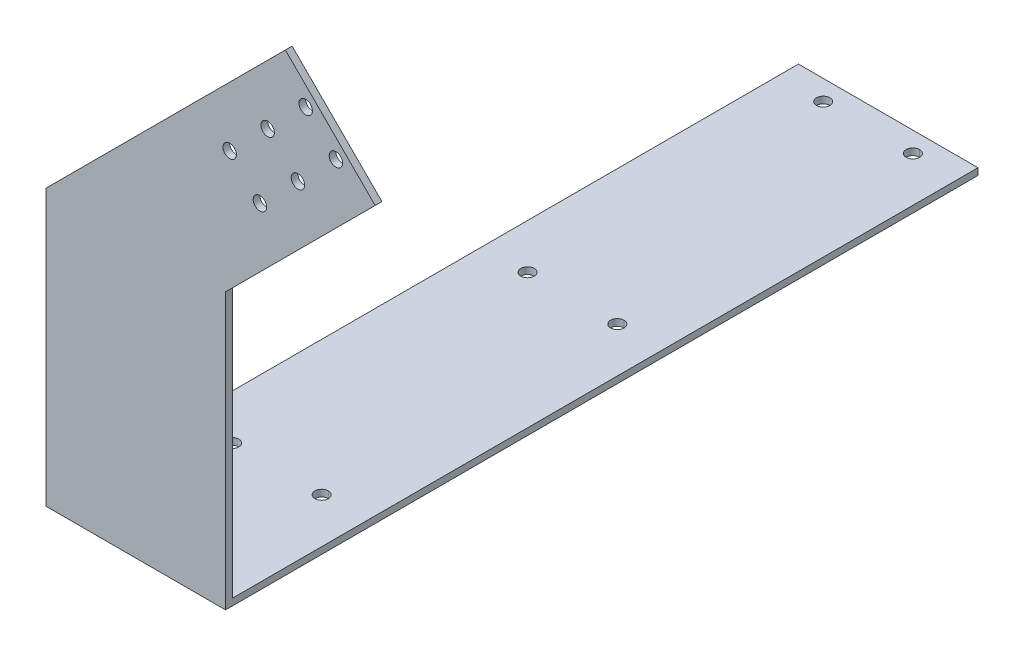
ISO-10303-21;
HEADER;
FILE_DESCRIPTION(('STEP AP214'),'2;1');
FILE_NAME('part.step','',(''),(''),'','','');
FILE_SCHEMA(('AUTOMOTIVE_DESIGN { 1 0 10303 214 1 1 1 1 }'));
ENDSEC;
DATA;
#1=APPLICATION_CONTEXT('core data for automotive mechanical design processes');
#2=APPLICATION_PROTOCOL_DEFINITION('international standard','automotive_design',2000,#1);
#3=PRODUCT_CONTEXT('',#1,'mechanical');
#4=PRODUCT('Part','Part','',(#3));
#5=PRODUCT_RELATED_PRODUCT_CATEGORY('part','',(#4));
#6=PRODUCT_DEFINITION_FORMATION('','',#4);
#7=PRODUCT_DEFINITION_CONTEXT('part definition',#1,'design');
#8=PRODUCT_DEFINITION('design','',#6,#7);
#9=PRODUCT_DEFINITION_SHAPE('','',#8);
#10=(LENGTH_UNIT() NAMED_UNIT(*) SI_UNIT(.MILLI.,.METRE.));
#11=(NAMED_UNIT(*) PLANE_ANGLE_UNIT() SI_UNIT($,.RADIAN.));
#12=(NAMED_UNIT(*) SI_UNIT($,.STERADIAN.) SOLID_ANGLE_UNIT());
#13=UNCERTAINTY_MEASURE_WITH_UNIT(LENGTH_MEASURE(1.E-05),#10,'distance_accuracy_value','');
#14=(GEOMETRIC_REPRESENTATION_CONTEXT(3) GLOBAL_UNCERTAINTY_ASSIGNED_CONTEXT((#13)) GLOBAL_UNIT_ASSIGNED_CONTEXT((#10,
#11,#12)) REPRESENTATION_CONTEXT('',''));
#15=CARTESIAN_POINT('',(0.,0.,0.));
#16=DIRECTION('',(0.,0.,1.));
#17=DIRECTION('',(1.,0.,0.));
#18=AXIS2_PLACEMENT_3D('',#15,#16,#17);
#19=CARTESIAN_POINT('',(244.242072319472,-1253.5476832005,-5408.71927487449));
#20=DIRECTION('',(-1.,0.,0.));
#21=DIRECTION('',(0.,0.,1.));
#22=AXIS2_PLACEMENT_3D('',#19,#20,#21);
#23=PLANE('',#22);
#24=DIRECTION('',(0.,-1.,0.));
#25=VECTOR('',#24,1.);
#26=CARTESIAN_POINT('',(244.242072319472,-1253.5476832005,-5402.36927487449));
#27=LINE('',#26,#25);
#28=CARTESIAN_POINT('',(244.242072319472,-999.547683200505,-5402.36927487449));
#29=VERTEX_POINT('',#28);
#30=CARTESIAN_POINT('',(244.242072319472,-1259.89768320051,-5402.36927487449));
#31=VERTEX_POINT('',#30);
#32=EDGE_CURVE('E123',#29,#31,#27,.T.);
#33=ORIENTED_EDGE('',*,*,#32,.F.);
#34=DIRECTION('',(0.,0.,1.));
#35=VECTOR('',#34,1.);
#36=CARTESIAN_POINT('',(244.242072319472,-999.547683200505,-5408.71927487449));
#37=LINE('',#36,#35);
#38=CARTESIAN_POINT('',(244.242072319472,-999.547683200505,-5408.71927487449));
#39=VERTEX_POINT('',#38);
#40=EDGE_CURVE('E11',#39,#29,#37,.T.);
#41=ORIENTED_EDGE('',*,*,#40,.F.);
#42=DIRECTION('',(0.,-1.,0.));
#43=VECTOR('',#42,1.);
#44=CARTESIAN_POINT('',(244.242072319472,-1253.5476832005,-5408.71927487449));
#45=LINE('',#44,#43);
#46=CARTESIAN_POINT('',(244.242072319472,-1253.5476832005,-5408.71927487449));
#47=VERTEX_POINT('',#46);
#48=EDGE_CURVE('E140',#39,#47,#45,.T.);
#49=ORIENTED_EDGE('',*,*,#48,.T.);
#50=DIRECTION('',(0.,0.,-1.));
#51=VECTOR('',#50,1.);
#52=CARTESIAN_POINT('',(244.242072319472,-1253.5476832005,-5402.36927487449));
#53=LINE('',#52,#51);
#54=CARTESIAN_POINT('',(244.242072319472,-1253.5476832005,-6113.56927487449));
#55=VERTEX_POINT('',#54);
#56=EDGE_CURVE('E217',#47,#55,#53,.T.);
#57=ORIENTED_EDGE('',*,*,#56,.T.);
#58=DIRECTION('',(0.,1.,0.));
#59=VECTOR('',#58,1.);
#60=CARTESIAN_POINT('',(244.242072319472,-1259.89768320051,-6113.56927487449));
#61=LINE('',#60,#59);
#62=CARTESIAN_POINT('',(244.242072319472,-1259.89768320051,-6113.56927487449));
#63=VERTEX_POINT('',#62);
#64=EDGE_CURVE('E283',#63,#55,#61,.T.);
#65=ORIENTED_EDGE('',*,*,#64,.F.);
#66=DIRECTION('',(0.,0.,-1.));
#67=VECTOR('',#66,1.);
#68=CARTESIAN_POINT('',(244.242072319472,-1259.89768320051,-5402.36927487449));
#69=LINE('',#68,#67);
#70=EDGE_CURVE('E164',#31,#63,#69,.T.);
#71=ORIENTED_EDGE('',*,*,#70,.F.);
#72=EDGE_LOOP('',(#33,#41,#49,#57,#65,#71));
#73=FACE_BOUND('',#72,.T.);
#74=ADVANCED_FACE('F43',(#73),#23,.T.);
#75=CARTESIAN_POINT('',(244.242072319472,-999.547683200505,-5408.71927487449));
#76=DIRECTION('',(-0.707106781186549,0.707106781186546,0.));
#77=DIRECTION('',(-0.707106781186546,-0.707106781186549,0.));
#78=AXIS2_PLACEMENT_3D('',#75,#76,#77);
#79=PLANE('',#78);
#80=DIRECTION('',(-0.707106781186546,-0.707106781186549,0.));
#81=VECTOR('',#80,1.);
#82=CARTESIAN_POINT('',(244.242072319472,-999.547683200505,-5402.36927487449));
#83=LINE('',#82,#81);
#84=CARTESIAN_POINT('',(470.516242299167,-773.273513220809,-5402.36927487449));
#85=VERTEX_POINT('',#84);
#86=EDGE_CURVE('E137',#85,#29,#83,.T.);
#87=ORIENTED_EDGE('',*,*,#86,.F.);
#88=DIRECTION('',(0.,0.,1.));
#89=VECTOR('',#88,1.);
#90=CARTESIAN_POINT('',(470.516242299167,-773.273513220809,-5408.71927487449));
#91=LINE('',#90,#89);
#92=CARTESIAN_POINT('',(470.516242299167,-773.273513220809,-5408.71927487449));
#93=VERTEX_POINT('',#92);
#94=EDGE_CURVE('E53',#93,#85,#91,.T.);
#95=ORIENTED_EDGE('',*,*,#94,.F.);
#96=DIRECTION('',(-0.707106781186546,-0.707106781186549,0.));
#97=VECTOR('',#96,1.);
#98=CARTESIAN_POINT('',(244.242072319472,-999.547683200505,-5408.71927487449));
#99=LINE('',#98,#97);
#100=EDGE_CURVE('E110',#93,#39,#99,.T.);
#101=ORIENTED_EDGE('',*,*,#100,.T.);
#102=ORIENTED_EDGE('',*,*,#40,.T.);
#103=EDGE_LOOP('',(#87,#95,#101,#102));
#104=FACE_BOUND('',#103,.T.);
#105=ADVANCED_FACE('F424',(#104),#79,.T.);
#106=CARTESIAN_POINT('',(470.516242299167,-773.273513220809,-5408.71927487449));
#107=DIRECTION('',(0.707088562607808,0.707124999295899,0.));
#108=DIRECTION('',(-0.707124999295899,0.707088562607808,0.));
#109=AXIS2_PLACEMENT_3D('',#106,#107,#108);
#110=PLANE('',#109);
#111=DIRECTION('',(-0.707124999295898,0.707088562607808,0.));
#112=VECTOR('',#111,1.);
#113=CARTESIAN_POINT('',(470.516242299167,-773.273513220809,-5402.36927487449));
#114=LINE('',#113,#112);
#115=CARTESIAN_POINT('',(555.373428556782,-858.126326963196,-5402.36927487449));
#116=VERTEX_POINT('',#115);
#117=EDGE_CURVE('E100',#116,#85,#114,.T.);
#118=ORIENTED_EDGE('',*,*,#117,.F.);
#119=DIRECTION('',(0.,0.,1.));
#120=VECTOR('',#119,1.);
#121=CARTESIAN_POINT('',(555.373428556782,-858.126326963196,-5408.71927487449));
#122=LINE('',#121,#120);
#123=CARTESIAN_POINT('',(555.373428556782,-858.126326963196,-5408.71927487449));
#124=VERTEX_POINT('',#123);
#125=EDGE_CURVE('E95',#124,#116,#122,.T.);
#126=ORIENTED_EDGE('',*,*,#125,.F.);
#127=DIRECTION('',(-0.707124999295898,0.707088562607808,0.));
#128=VECTOR('',#127,1.);
#129=CARTESIAN_POINT('',(470.516242299167,-773.273513220809,-5408.71927487449));
#130=LINE('',#129,#128);
#131=EDGE_CURVE('E98',#124,#93,#130,.T.);
#132=ORIENTED_EDGE('',*,*,#131,.T.);
#133=ORIENTED_EDGE('',*,*,#94,.T.);
#134=EDGE_LOOP('',(#118,#126,#132,#133));
#135=FACE_BOUND('',#134,.T.);
#136=ADVANCED_FACE('F97',(#135),#110,.T.);
#137=CARTESIAN_POINT('',(413.952072319473,-999.547683200505,-5408.71927487449));
#138=DIRECTION('',(0.707106781186547,-0.707106781186548,0.));
#139=DIRECTION('',(0.707106781186548,0.707106781186547,0.));
#140=AXIS2_PLACEMENT_3D('',#137,#138,#139);
#141=PLANE('',#140);
#142=DIRECTION('',(0.707106781186548,0.707106781186547,0.));
#143=VECTOR('',#142,1.);
#144=CARTESIAN_POINT('',(413.952072319473,-999.547683200505,-5402.36927487449));
#145=LINE('',#144,#143);
#146=CARTESIAN_POINT('',(413.952072319473,-999.547683200505,-5402.36927487449));
#147=VERTEX_POINT('',#146);
#148=EDGE_CURVE('E132',#147,#116,#145,.T.);
#149=ORIENTED_EDGE('',*,*,#148,.F.);
#150=DIRECTION('',(0.,0.,1.));
#151=VECTOR('',#150,1.);
#152=CARTESIAN_POINT('',(413.952072319473,-999.547683200505,-5408.71927487449));
#153=LINE('',#152,#151);
#154=CARTESIAN_POINT('',(413.952072319473,-999.547683200505,-5408.71927487449));
#155=VERTEX_POINT('',#154);
#156=EDGE_CURVE('E46',#155,#147,#153,.T.);
#157=ORIENTED_EDGE('',*,*,#156,.F.);
#158=DIRECTION('',(0.707106781186548,0.707106781186547,0.));
#159=VECTOR('',#158,1.);
#160=CARTESIAN_POINT('',(413.952072319473,-999.547683200505,-5408.71927487449));
#161=LINE('',#160,#159);
#162=EDGE_CURVE('E108',#155,#124,#161,.T.);
#163=ORIENTED_EDGE('',*,*,#162,.T.);
#164=ORIENTED_EDGE('',*,*,#125,.T.);
#165=EDGE_LOOP('',(#149,#157,#163,#164));
#166=FACE_BOUND('',#165,.T.);
#167=ADVANCED_FACE('F113',(#166),#141,.T.);
#168=CARTESIAN_POINT('',(413.952072319473,-1253.5476832005,-5408.71927487449));
#169=DIRECTION('',(1.,0.,0.));
#170=DIRECTION('',(0.,1.,0.));
#171=AXIS2_PLACEMENT_3D('',#168,#169,#170);
#172=PLANE('',#171);
#173=DIRECTION('',(0.,1.,0.));
#174=VECTOR('',#173,1.);
#175=CARTESIAN_POINT('',(413.952072319473,-1253.5476832005,-5402.36927487449));
#176=LINE('',#175,#174);
#177=CARTESIAN_POINT('',(413.952072319473,-1259.8976832005,-5402.36927487449));
#178=VERTEX_POINT('',#177);
#179=EDGE_CURVE('E127',#178,#147,#176,.T.);
#180=ORIENTED_EDGE('',*,*,#179,.F.);
#181=DIRECTION('',(0.,0.,-1.));
#182=VECTOR('',#181,1.);
#183=CARTESIAN_POINT('',(413.952072319473,-1259.8976832005,-5402.36927487449));
#184=LINE('',#183,#182);
#185=CARTESIAN_POINT('',(413.952072319473,-1259.8976832005,-6113.56927487449));
#186=VERTEX_POINT('',#185);
#187=EDGE_CURVE('E168',#178,#186,#184,.T.);
#188=ORIENTED_EDGE('',*,*,#187,.T.);
#189=DIRECTION('',(0.,1.,0.));
#190=VECTOR('',#189,1.);
#191=CARTESIAN_POINT('',(413.952072319473,-1259.8976832005,-6113.56927487449));
#192=LINE('',#191,#190);
#193=CARTESIAN_POINT('',(413.952072319473,-1253.5476832005,-6113.56927487449));
#194=VERTEX_POINT('',#193);
#195=EDGE_CURVE('E212',#186,#194,#192,.T.);
#196=ORIENTED_EDGE('',*,*,#195,.T.);
#197=DIRECTION('',(0.,0.,-1.));
#198=VECTOR('',#197,1.);
#199=CARTESIAN_POINT('',(413.952072319473,-1253.5476832005,-5402.36927487449));
#200=LINE('',#199,#198);
#201=CARTESIAN_POINT('',(413.952072319473,-1253.5476832005,-5408.71927487449));
#202=VERTEX_POINT('',#201);
#203=EDGE_CURVE('E225',#202,#194,#200,.T.);
#204=ORIENTED_EDGE('',*,*,#203,.F.);
#205=DIRECTION('',(0.,1.,0.));
#206=VECTOR('',#205,1.);
#207=CARTESIAN_POINT('',(413.952072319473,-1253.5476832005,-5408.71927487449));
#208=LINE('',#207,#206);
#209=EDGE_CURVE('E115',#202,#155,#208,.T.);
#210=ORIENTED_EDGE('',*,*,#209,.T.);
#211=ORIENTED_EDGE('',*,*,#156,.T.);
#212=EDGE_LOOP('',(#180,#188,#196,#204,#210,#211));
#213=FACE_BOUND('',#212,.T.);
#214=ADVANCED_FACE('F146',(#213),#172,.T.);
#215=CARTESIAN_POINT('',(329.097072319472,-1126.5476832005,-5408.71927487449));
#216=DIRECTION('',(0.,0.,1.));
#217=DIRECTION('',(1.,0.,0.));
#218=AXIS2_PLACEMENT_3D('',#215,#216,#217);
#219=PLANE('',#218);
#220=CARTESIAN_POINT('',(489.665881414306,-810.38221510875,-5408.71927487449));
#221=DIRECTION('',(0.,0.,1.));
#222=DIRECTION('',(-1.,0.,0.));
#223=AXIS2_PLACEMENT_3D('',#220,#221,#222);
#224=CIRCLE('',#223,6.35000000000007);
#225=CARTESIAN_POINT('',(483.315881414306,-810.38221510875,-5408.71927487449));
#226=VERTEX_POINT('',#225);
#227=EDGE_CURVE('E292',#226,#226,#224,.T.);
#228=ORIENTED_EDGE('',*,*,#227,.T.);
#229=EDGE_LOOP('',(#228));
#230=FACE_BOUND('',#229,.T.);
#231=CARTESIAN_POINT('',(453.746707961474,-846.305090529091,-5408.71927487449));
#232=DIRECTION('',(0.,0.,1.));
#233=DIRECTION('',(-1.,0.,0.));
#234=AXIS2_PLACEMENT_3D('',#231,#232,#233);
#235=CIRCLE('',#234,6.35000000000007);
#236=CARTESIAN_POINT('',(447.396707961474,-846.305090529091,-5408.71927487449));
#237=VERTEX_POINT('',#236);
#238=EDGE_CURVE('E300',#237,#237,#235,.T.);
#239=ORIENTED_EDGE('',*,*,#238,.T.);
#240=EDGE_LOOP('',(#239));
#241=FACE_BOUND('',#240,.T.);
#242=CARTESIAN_POINT('',(417.827534508641,-882.227965949432,-5408.71927487449));
#243=DIRECTION('',(0.,0.,1.));
#244=DIRECTION('',(-1.,0.,0.));
#245=AXIS2_PLACEMENT_3D('',#242,#243,#244);
#246=CIRCLE('',#245,6.35000000000006);
#247=CARTESIAN_POINT('',(411.477534508641,-882.227965949432,-5408.71927487449));
#248=VERTEX_POINT('',#247);
#249=EDGE_CURVE('E308',#248,#248,#246,.T.);
#250=ORIENTED_EDGE('',*,*,#249,.T.);
#251=EDGE_LOOP('',(#250));
#252=FACE_BOUND('',#251,.T.);
#253=CARTESIAN_POINT('',(446.421690982853,-910.820649025925,-5408.71927487449));
#254=DIRECTION('',(0.,0.,1.));
#255=DIRECTION('',(1.,0.,0.));
#256=AXIS2_PLACEMENT_3D('',#253,#254,#255);
#257=CIRCLE('',#256,6.35000000000007);
#258=CARTESIAN_POINT('',(452.771690982853,-910.820649025925,-5408.71927487449));
#259=VERTEX_POINT('',#258);
#260=EDGE_CURVE('E316',#259,#259,#257,.T.);
#261=ORIENTED_EDGE('',*,*,#260,.T.);
#262=EDGE_LOOP('',(#261));
#263=FACE_BOUND('',#262,.T.);
#264=CARTESIAN_POINT('',(482.342715467129,-874.899624541648,-5408.71927487449));
#265=DIRECTION('',(0.,0.,1.));
#266=DIRECTION('',(1.,0.,0.));
#267=AXIS2_PLACEMENT_3D('',#264,#265,#266);
#268=CIRCLE('',#267,6.35000000000006);
#269=CARTESIAN_POINT('',(488.692715467129,-874.899624541648,-5408.71927487449));
#270=VERTEX_POINT('',#269);
#271=EDGE_CURVE('E324',#270,#270,#268,.T.);
#272=ORIENTED_EDGE('',*,*,#271,.T.);
#273=EDGE_LOOP('',(#272));
#274=FACE_BOUND('',#273,.T.);
#275=CARTESIAN_POINT('',(518.263739951405,-838.978600057371,-5408.71927487449));
#276=DIRECTION('',(0.,0.,1.));
#277=DIRECTION('',(1.,0.,0.));
#278=AXIS2_PLACEMENT_3D('',#275,#276,#277);
#279=CIRCLE('',#278,6.35000000000002);
#280=CARTESIAN_POINT('',(524.613739951405,-838.978600057371,-5408.71927487449));
#281=VERTEX_POINT('',#280);
#282=EDGE_CURVE('E128',#281,#281,#279,.T.);
#283=ORIENTED_EDGE('',*,*,#282,.T.);
#284=EDGE_LOOP('',(#283));
#285=FACE_BOUND('',#284,.T.);
#286=ORIENTED_EDGE('',*,*,#48,.F.);
#287=ORIENTED_EDGE('',*,*,#100,.F.);
#288=ORIENTED_EDGE('',*,*,#131,.F.);
#289=ORIENTED_EDGE('',*,*,#162,.F.);
#290=ORIENTED_EDGE('',*,*,#209,.F.);
#291=DIRECTION('',(1.,0.,0.));
#292=VECTOR('',#291,1.);
#293=CARTESIAN_POINT('',(413.952072319473,-1253.5476832005,-5408.71927487449));
#294=LINE('',#293,#292);
#295=EDGE_CURVE('E89',#47,#202,#294,.T.);
#296=ORIENTED_EDGE('',*,*,#295,.F.);
#297=EDGE_LOOP('',(#286,#287,#288,#289,#290,#296));
#298=FACE_BOUND('',#297,.T.);
#299=ADVANCED_FACE('F107',(#230,#241,#252,#263,#274,#285,#298),#219,.F.);
#300=CARTESIAN_POINT('',(329.097072319472,-1126.5476832005,-5402.36927487449));
#301=DIRECTION('',(0.,0.,1.));
#302=DIRECTION('',(1.,0.,0.));
#303=AXIS2_PLACEMENT_3D('',#300,#301,#302);
#304=PLANE('',#303);
#305=CARTESIAN_POINT('',(489.665881414306,-810.38221510875,-5402.36927487449));
#306=DIRECTION('',(0.,0.,1.));
#307=DIRECTION('',(-1.,0.,0.));
#308=AXIS2_PLACEMENT_3D('',#305,#306,#307);
#309=CIRCLE('',#308,6.35000000000007);
#310=CARTESIAN_POINT('',(483.315881414306,-810.38221510875,-5402.36927487449));
#311=VERTEX_POINT('',#310);
#312=EDGE_CURVE('E270',#311,#311,#309,.T.);
#313=ORIENTED_EDGE('',*,*,#312,.F.);
#314=EDGE_LOOP('',(#313));
#315=FACE_BOUND('',#314,.T.);
#316=CARTESIAN_POINT('',(453.746707961474,-846.305090529091,-5402.36927487449));
#317=DIRECTION('',(0.,0.,1.));
#318=DIRECTION('',(-1.,0.,0.));
#319=AXIS2_PLACEMENT_3D('',#316,#317,#318);
#320=CIRCLE('',#319,6.35000000000007);
#321=CARTESIAN_POINT('',(447.396707961474,-846.305090529091,-5402.36927487449));
#322=VERTEX_POINT('',#321);
#323=EDGE_CURVE('E296',#322,#322,#320,.T.);
#324=ORIENTED_EDGE('',*,*,#323,.F.);
#325=EDGE_LOOP('',(#324));
#326=FACE_BOUND('',#325,.T.);
#327=CARTESIAN_POINT('',(417.827534508641,-882.227965949432,-5402.36927487449));
#328=DIRECTION('',(0.,0.,1.));
#329=DIRECTION('',(-1.,0.,0.));
#330=AXIS2_PLACEMENT_3D('',#327,#328,#329);
#331=CIRCLE('',#330,6.35000000000006);
#332=CARTESIAN_POINT('',(411.477534508641,-882.227965949432,-5402.36927487449));
#333=VERTEX_POINT('',#332);
#334=EDGE_CURVE('E304',#333,#333,#331,.T.);
#335=ORIENTED_EDGE('',*,*,#334,.F.);
#336=EDGE_LOOP('',(#335));
#337=FACE_BOUND('',#336,.T.);
#338=CARTESIAN_POINT('',(446.421690982853,-910.820649025925,-5402.36927487449));
#339=DIRECTION('',(0.,0.,1.));
#340=DIRECTION('',(1.,0.,0.));
#341=AXIS2_PLACEMENT_3D('',#338,#339,#340);
#342=CIRCLE('',#341,6.35000000000007);
#343=CARTESIAN_POINT('',(452.771690982853,-910.820649025925,-5402.36927487449));
#344=VERTEX_POINT('',#343);
#345=EDGE_CURVE('E312',#344,#344,#342,.T.);
#346=ORIENTED_EDGE('',*,*,#345,.F.);
#347=EDGE_LOOP('',(#346));
#348=FACE_BOUND('',#347,.T.);
#349=CARTESIAN_POINT('',(482.342715467129,-874.899624541648,-5402.36927487449));
#350=DIRECTION('',(0.,0.,1.));
#351=DIRECTION('',(1.,0.,0.));
#352=AXIS2_PLACEMENT_3D('',#349,#350,#351);
#353=CIRCLE('',#352,6.35000000000006);
#354=CARTESIAN_POINT('',(488.692715467129,-874.899624541648,-5402.36927487449));
#355=VERTEX_POINT('',#354);
#356=EDGE_CURVE('E320',#355,#355,#353,.T.);
#357=ORIENTED_EDGE('',*,*,#356,.F.);
#358=EDGE_LOOP('',(#357));
#359=FACE_BOUND('',#358,.T.);
#360=CARTESIAN_POINT('',(518.263739951405,-838.978600057371,-5402.36927487449));
#361=DIRECTION('',(0.,0.,1.));
#362=DIRECTION('',(1.,0.,0.));
#363=AXIS2_PLACEMENT_3D('',#360,#361,#362);
#364=CIRCLE('',#363,6.35000000000002);
#365=CARTESIAN_POINT('',(524.613739951405,-838.978600057371,-5402.36927487449));
#366=VERTEX_POINT('',#365);
#367=EDGE_CURVE('E328',#366,#366,#364,.T.);
#368=ORIENTED_EDGE('',*,*,#367,.F.);
#369=EDGE_LOOP('',(#368));
#370=FACE_BOUND('',#369,.T.);
#371=ORIENTED_EDGE('',*,*,#32,.T.);
#372=DIRECTION('',(-1.,0.,0.));
#373=VECTOR('',#372,1.);
#374=CARTESIAN_POINT('',(329.097072319472,-1259.8976832005,-5402.36927487449));
#375=LINE('',#374,#373);
#376=EDGE_CURVE('E154',#178,#31,#375,.T.);
#377=ORIENTED_EDGE('',*,*,#376,.F.);
#378=ORIENTED_EDGE('',*,*,#179,.T.);
#379=ORIENTED_EDGE('',*,*,#148,.T.);
#380=ORIENTED_EDGE('',*,*,#117,.T.);
#381=ORIENTED_EDGE('',*,*,#86,.T.);
#382=EDGE_LOOP('',(#371,#377,#378,#379,#380,#381));
#383=FACE_BOUND('',#382,.T.);
#384=ADVANCED_FACE('F152',(#315,#326,#337,#348,#359,#370,#383),#304,.T.);
#385=CARTESIAN_POINT('',(518.263739951405,-838.978600057371,-5408.71927487449));
#386=DIRECTION('',(0.,0.,1.));
#387=DIRECTION('',(1.,0.,0.));
#388=AXIS2_PLACEMENT_3D('',#385,#386,#387);
#389=CYLINDRICAL_SURFACE('',#388,6.35000000000002);
#390=ORIENTED_EDGE('',*,*,#282,.F.);
#391=EDGE_LOOP('',(#390));
#392=FACE_BOUND('',#391,.T.);
#393=ORIENTED_EDGE('',*,*,#367,.T.);
#394=EDGE_LOOP('',(#393));
#395=FACE_BOUND('',#394,.T.);
#396=ADVANCED_FACE('F462',(#392,#395),#389,.F.);
#397=CARTESIAN_POINT('',(482.342715467129,-874.899624541648,-5408.71927487449));
#398=DIRECTION('',(0.,0.,1.));
#399=DIRECTION('',(1.,0.,0.));
#400=AXIS2_PLACEMENT_3D('',#397,#398,#399);
#401=CYLINDRICAL_SURFACE('',#400,6.35000000000006);
#402=ORIENTED_EDGE('',*,*,#271,.F.);
#403=EDGE_LOOP('',(#402));
#404=FACE_BOUND('',#403,.T.);
#405=ORIENTED_EDGE('',*,*,#356,.T.);
#406=EDGE_LOOP('',(#405));
#407=FACE_BOUND('',#406,.T.);
#408=ADVANCED_FACE('F458',(#404,#407),#401,.F.);
#409=CARTESIAN_POINT('',(446.421690982853,-910.820649025925,-5408.71927487449));
#410=DIRECTION('',(0.,0.,1.));
#411=DIRECTION('',(1.,0.,0.));
#412=AXIS2_PLACEMENT_3D('',#409,#410,#411);
#413=CYLINDRICAL_SURFACE('',#412,6.35000000000007);
#414=ORIENTED_EDGE('',*,*,#260,.F.);
#415=EDGE_LOOP('',(#414));
#416=FACE_BOUND('',#415,.T.);
#417=ORIENTED_EDGE('',*,*,#345,.T.);
#418=EDGE_LOOP('',(#417));
#419=FACE_BOUND('',#418,.T.);
#420=ADVANCED_FACE('F454',(#416,#419),#413,.F.);
#421=CARTESIAN_POINT('',(417.827534508641,-882.227965949432,-5408.71927487449));
#422=DIRECTION('',(0.,0.,1.));
#423=DIRECTION('',(1.,0.,0.));
#424=AXIS2_PLACEMENT_3D('',#421,#422,#423);
#425=CYLINDRICAL_SURFACE('',#424,6.35000000000006);
#426=ORIENTED_EDGE('',*,*,#249,.F.);
#427=EDGE_LOOP('',(#426));
#428=FACE_BOUND('',#427,.T.);
#429=ORIENTED_EDGE('',*,*,#334,.T.);
#430=EDGE_LOOP('',(#429));
#431=FACE_BOUND('',#430,.T.);
#432=ADVANCED_FACE('F450',(#428,#431),#425,.F.);
#433=CARTESIAN_POINT('',(453.746707961474,-846.305090529091,-5408.71927487449));
#434=DIRECTION('',(0.,0.,1.));
#435=DIRECTION('',(1.,0.,0.));
#436=AXIS2_PLACEMENT_3D('',#433,#434,#435);
#437=CYLINDRICAL_SURFACE('',#436,6.35000000000007);
#438=ORIENTED_EDGE('',*,*,#238,.F.);
#439=EDGE_LOOP('',(#438));
#440=FACE_BOUND('',#439,.T.);
#441=ORIENTED_EDGE('',*,*,#323,.T.);
#442=EDGE_LOOP('',(#441));
#443=FACE_BOUND('',#442,.T.);
#444=ADVANCED_FACE('F418',(#440,#443),#437,.F.);
#445=CARTESIAN_POINT('',(489.665881414306,-810.38221510875,-5408.71927487449));
#446=DIRECTION('',(0.,0.,1.));
#447=DIRECTION('',(1.,0.,0.));
#448=AXIS2_PLACEMENT_3D('',#445,#446,#447);
#449=CYLINDRICAL_SURFACE('',#448,6.35000000000007);
#450=ORIENTED_EDGE('',*,*,#227,.F.);
#451=EDGE_LOOP('',(#450));
#452=FACE_BOUND('',#451,.T.);
#453=ORIENTED_EDGE('',*,*,#312,.T.);
#454=EDGE_LOOP('',(#453));
#455=FACE_BOUND('',#454,.T.);
#456=ADVANCED_FACE('F409',(#452,#455),#449,.F.);
#457=CARTESIAN_POINT('',(329.097072319472,-1253.5476832005,-5402.36927487449));
#458=DIRECTION('',(0.,-1.,0.));
#459=DIRECTION('',(1.,0.,0.));
#460=AXIS2_PLACEMENT_3D('',#457,#458,#459);
#461=PLANE('',#460);
#462=CARTESIAN_POINT('',(286.672072319629,-1253.5476832005,-5815.11927487447));
#463=DIRECTION('',(0.,-1.,0.));
#464=DIRECTION('',(1.,0.,0.));
#465=AXIS2_PLACEMENT_3D('',#462,#463,#464);
#466=CIRCLE('',#465,6.35000000000012);
#467=CARTESIAN_POINT('',(293.022072319629,-1253.5476832005,-5815.11927487447));
#468=VERTEX_POINT('',#467);
#469=EDGE_CURVE('E213',#468,#468,#466,.F.);
#470=ORIENTED_EDGE('',*,*,#469,.F.);
#471=EDGE_LOOP('',(#470));
#472=FACE_BOUND('',#471,.T.);
#473=CARTESIAN_POINT('',(371.422072319626,-1253.5476832005,-6094.51927487449));
#474=DIRECTION('',(0.,-1.,0.));
#475=DIRECTION('',(1.,0.,0.));
#476=AXIS2_PLACEMENT_3D('',#473,#474,#475);
#477=CIRCLE('',#476,6.34999999999994);
#478=CARTESIAN_POINT('',(371.472072319549,-1253.5476832005,-6088.16947172794));
#479=VERTEX_POINT('',#478);
#480=CARTESIAN_POINT('',(371.472072319549,-1253.5476832005,-6100.86907802105));
#481=VERTEX_POINT('',#480);
#482=EDGE_CURVE('E229',#479,#481,#477,.T.);
#483=ORIENTED_EDGE('',*,*,#482,.T.);
#484=CARTESIAN_POINT('',(371.522072319473,-1253.5476832005,-6094.51927487449));
#485=DIRECTION('',(0.,-1.,0.));
#486=DIRECTION('',(1.,0.,0.));
#487=AXIS2_PLACEMENT_3D('',#484,#485,#486);
#488=CIRCLE('',#487,6.34999999999995);
#489=EDGE_CURVE('E233',#481,#479,#488,.T.);
#490=ORIENTED_EDGE('',*,*,#489,.T.);
#491=EDGE_LOOP('',(#483,#490));
#492=FACE_BOUND('',#491,.T.);
#493=CARTESIAN_POINT('',(371.422072319626,-1253.5476832005,-5815.11927487449));
#494=DIRECTION('',(0.,-1.,0.));
#495=DIRECTION('',(1.,0.,0.));
#496=AXIS2_PLACEMENT_3D('',#493,#494,#495);
#497=CIRCLE('',#496,6.34999999999995);
#498=CARTESIAN_POINT('',(371.472072319494,-1253.5476832005,-5808.76947172794));
#499=VERTEX_POINT('',#498);
#500=CARTESIAN_POINT('',(371.472072319485,-1253.5476832005,-5821.46907802105));
#501=VERTEX_POINT('',#500);
#502=EDGE_CURVE('E237',#499,#501,#497,.T.);
#503=ORIENTED_EDGE('',*,*,#502,.T.);
#504=CARTESIAN_POINT('',(371.522072319472,-1253.5476832005,-5815.11927487449));
#505=DIRECTION('',(0.,-1.,0.));
#506=DIRECTION('',(1.,0.,0.));
#507=AXIS2_PLACEMENT_3D('',#504,#505,#506);
#508=CIRCLE('',#507,6.35000000000089);
#509=EDGE_CURVE('E241',#501,#499,#508,.T.);
#510=ORIENTED_EDGE('',*,*,#509,.T.);
#511=EDGE_LOOP('',(#503,#510));
#512=FACE_BOUND('',#511,.T.);
#513=CARTESIAN_POINT('',(371.522072319472,-1253.5476832005,-5535.71927487449));
#514=DIRECTION('',(0.,-1.,0.));
#515=DIRECTION('',(1.,0.,0.));
#516=AXIS2_PLACEMENT_3D('',#513,#514,#515);
#517=CIRCLE('',#516,6.34999999999996);
#518=CARTESIAN_POINT('',(371.472072319553,-1253.5476832005,-5542.06907802105));
#519=VERTEX_POINT('',#518);
#520=CARTESIAN_POINT('',(371.472072319545,-1253.5476832005,-5529.36947172794));
#521=VERTEX_POINT('',#520);
#522=EDGE_CURVE('E245',#519,#521,#517,.T.);
#523=ORIENTED_EDGE('',*,*,#522,.T.);
#524=CARTESIAN_POINT('',(371.422072319626,-1253.5476832005,-5535.71927487449));
#525=DIRECTION('',(0.,-1.,0.));
#526=DIRECTION('',(1.,0.,0.));
#527=AXIS2_PLACEMENT_3D('',#524,#525,#526);
#528=CIRCLE('',#527,6.34999999999996);
#529=EDGE_CURVE('E249',#521,#519,#528,.T.);
#530=ORIENTED_EDGE('',*,*,#529,.T.);
#531=EDGE_LOOP('',(#523,#530));
#532=FACE_BOUND('',#531,.T.);
#533=CARTESIAN_POINT('',(286.772072319622,-1253.5476832005,-5535.71927487447));
#534=DIRECTION('',(0.,-1.,0.));
#535=DIRECTION('',(1.,0.,0.));
#536=AXIS2_PLACEMENT_3D('',#533,#534,#535);
#537=CIRCLE('',#536,6.34999999999994);
#538=CARTESIAN_POINT('',(293.122072319622,-1253.5476832005,-5535.71927487447));
#539=VERTEX_POINT('',#538);
#540=EDGE_CURVE('E253',#539,#539,#537,.F.);
#541=ORIENTED_EDGE('',*,*,#540,.F.);
#542=EDGE_LOOP('',(#541));
#543=FACE_BOUND('',#542,.T.);
#544=CARTESIAN_POINT('',(286.672072319483,-1253.5476832005,-6094.51927487447));
#545=DIRECTION('',(0.,-1.,0.));
#546=DIRECTION('',(1.,0.,0.));
#547=AXIS2_PLACEMENT_3D('',#544,#545,#546);
#548=CIRCLE('',#547,6.34999999999994);
#549=CARTESIAN_POINT('',(293.022072319482,-1253.5476832005,-6094.51927487447));
#550=VERTEX_POINT('',#549);
#551=EDGE_CURVE('E257',#550,#550,#548,.F.);
#552=ORIENTED_EDGE('',*,*,#551,.F.);
#553=EDGE_LOOP('',(#552));
#554=FACE_BOUND('',#553,.T.);
#555=ORIENTED_EDGE('',*,*,#56,.F.);
#556=ORIENTED_EDGE('',*,*,#295,.T.);
#557=ORIENTED_EDGE('',*,*,#203,.T.);
#558=DIRECTION('',(-1.,0.,0.));
#559=VECTOR('',#558,1.);
#560=CARTESIAN_POINT('',(329.097072319472,-1253.5476832005,-6113.56927487449));
#561=LINE('',#560,#559);
#562=EDGE_CURVE('E221',#194,#55,#561,.T.);
#563=ORIENTED_EDGE('',*,*,#562,.T.);
#564=EDGE_LOOP('',(#555,#556,#557,#563));
#565=FACE_BOUND('',#564,.T.);
#566=ADVANCED_FACE('F342',(#472,#492,#512,#532,#543,#554,#565),#461,.F.);
#567=CARTESIAN_POINT('',(371.522072319472,-1259.8976832005,-5535.71927487449));
#568=DIRECTION('',(0.,1.,0.));
#569=DIRECTION('',(-1.,0.,0.));
#570=AXIS2_PLACEMENT_3D('',#567,#568,#569);
#571=CYLINDRICAL_SURFACE('',#570,6.34999999999996);
#572=ORIENTED_EDGE('',*,*,#522,.F.);
#573=DIRECTION('',(0.,1.,0.));
#574=VECTOR('',#573,1.);
#575=CARTESIAN_POINT('',(371.472072319553,-1259.8976832005,-5542.06907802105));
#576=LINE('',#575,#574);
#577=CARTESIAN_POINT('',(371.472072319553,-1259.8976832005,-5542.06907802105));
#578=VERTEX_POINT('',#577);
#579=EDGE_CURVE('E265',#578,#519,#576,.T.);
#580=ORIENTED_EDGE('',*,*,#579,.F.);
#581=CARTESIAN_POINT('',(371.522072319472,-1259.8976832005,-5535.71927487449));
#582=DIRECTION('',(0.,-1.,0.));
#583=DIRECTION('',(1.,0.,0.));
#584=AXIS2_PLACEMENT_3D('',#581,#582,#583);
#585=CIRCLE('',#584,6.34999999999996);
#586=CARTESIAN_POINT('',(371.472072319545,-1259.8976832005,-5529.36947172794));
#587=VERTEX_POINT('',#586);
#588=EDGE_CURVE('E196',#578,#587,#585,.T.);
#589=ORIENTED_EDGE('',*,*,#588,.T.);
#590=DIRECTION('',(0.,1.,0.));
#591=VECTOR('',#590,1.);
#592=CARTESIAN_POINT('',(371.472072319545,-1259.8976832005,-5529.36947172794));
#593=LINE('',#592,#591);
#594=EDGE_CURVE('E261',#587,#521,#593,.T.);
#595=ORIENTED_EDGE('',*,*,#594,.T.);
#596=EDGE_LOOP('',(#572,#580,#589,#595));
#597=FACE_BOUND('',#596,.T.);
#598=ADVANCED_FACE('F391',(#597),#571,.F.);
#599=CARTESIAN_POINT('',(371.422072319626,-1259.8976832005,-5815.11927487449));
#600=DIRECTION('',(0.,1.,0.));
#601=DIRECTION('',(-1.,0.,0.));
#602=AXIS2_PLACEMENT_3D('',#599,#600,#601);
#603=CYLINDRICAL_SURFACE('',#602,6.34999999999995);
#604=ORIENTED_EDGE('',*,*,#502,.F.);
#605=DIRECTION('',(0.,1.,0.));
#606=VECTOR('',#605,1.);
#607=CARTESIAN_POINT('',(371.472072319494,-1259.8976832005,-5808.76947172794));
#608=LINE('',#607,#606);
#609=CARTESIAN_POINT('',(371.472072319494,-1259.8976832005,-5808.76947172794));
#610=VERTEX_POINT('',#609);
#611=EDGE_CURVE('E266',#610,#499,#608,.T.);
#612=ORIENTED_EDGE('',*,*,#611,.F.);
#613=CARTESIAN_POINT('',(371.422072319626,-1259.8976832005,-5815.11927487449));
#614=DIRECTION('',(0.,-1.,0.));
#615=DIRECTION('',(1.,0.,0.));
#616=AXIS2_PLACEMENT_3D('',#613,#614,#615);
#617=CIRCLE('',#616,6.34999999999995);
#618=CARTESIAN_POINT('',(371.472072319485,-1259.8976832005,-5821.46907802105));
#619=VERTEX_POINT('',#618);
#620=EDGE_CURVE('E188',#610,#619,#617,.T.);
#621=ORIENTED_EDGE('',*,*,#620,.T.);
#622=DIRECTION('',(0.,1.,0.));
#623=VECTOR('',#622,1.);
#624=CARTESIAN_POINT('',(371.472072319485,-1259.8976832005,-5821.46907802105));
#625=LINE('',#624,#623);
#626=EDGE_CURVE('E271',#619,#501,#625,.T.);
#627=ORIENTED_EDGE('',*,*,#626,.T.);
#628=EDGE_LOOP('',(#604,#612,#621,#627));
#629=FACE_BOUND('',#628,.T.);
#630=ADVANCED_FACE('F416',(#629),#603,.F.);
#631=CARTESIAN_POINT('',(371.422072319626,-1259.8976832005,-6094.51927487449));
#632=DIRECTION('',(0.,1.,0.));
#633=DIRECTION('',(-1.,0.,0.));
#634=AXIS2_PLACEMENT_3D('',#631,#632,#633);
#635=CYLINDRICAL_SURFACE('',#634,6.34999999999994);
#636=ORIENTED_EDGE('',*,*,#482,.F.);
#637=DIRECTION('',(0.,1.,0.));
#638=VECTOR('',#637,1.);
#639=CARTESIAN_POINT('',(371.472072319549,-1259.8976832005,-6088.16947172794));
#640=LINE('',#639,#638);
#641=CARTESIAN_POINT('',(371.472072319549,-1259.8976832005,-6088.16947172794));
#642=VERTEX_POINT('',#641);
#643=EDGE_CURVE('E275',#642,#479,#640,.T.);
#644=ORIENTED_EDGE('',*,*,#643,.F.);
#645=CARTESIAN_POINT('',(371.422072319626,-1259.8976832005,-6094.51927487449));
#646=DIRECTION('',(0.,-1.,0.));
#647=DIRECTION('',(1.,0.,0.));
#648=AXIS2_PLACEMENT_3D('',#645,#646,#647);
#649=CIRCLE('',#648,6.34999999999994);
#650=CARTESIAN_POINT('',(371.472072319549,-1259.8976832005,-6100.86907802105));
#651=VERTEX_POINT('',#650);
#652=EDGE_CURVE('E175',#642,#651,#649,.T.);
#653=ORIENTED_EDGE('',*,*,#652,.T.);
#654=DIRECTION('',(0.,1.,0.));
#655=VECTOR('',#654,1.);
#656=CARTESIAN_POINT('',(371.472072319549,-1259.8976832005,-6100.86907802105));
#657=LINE('',#656,#655);
#658=EDGE_CURVE('E279',#651,#481,#657,.T.);
#659=ORIENTED_EDGE('',*,*,#658,.T.);
#660=EDGE_LOOP('',(#636,#644,#653,#659));
#661=FACE_BOUND('',#660,.T.);
#662=ADVANCED_FACE('F533',(#661),#635,.F.);
#663=CARTESIAN_POINT('',(329.097072319472,-1259.8976832005,-6113.56927487449));
#664=DIRECTION('',(0.,0.,-1.));
#665=DIRECTION('',(-1.,0.,0.));
#666=AXIS2_PLACEMENT_3D('',#663,#664,#665);
#667=PLANE('',#666);
#668=ORIENTED_EDGE('',*,*,#562,.F.);
#669=ORIENTED_EDGE('',*,*,#195,.F.);
#670=DIRECTION('',(-1.,0.,0.));
#671=VECTOR('',#670,1.);
#672=CARTESIAN_POINT('',(329.097072319472,-1259.8976832005,-6113.56927487449));
#673=LINE('',#672,#671);
#674=EDGE_CURVE('E172',#186,#63,#673,.T.);
#675=ORIENTED_EDGE('',*,*,#674,.T.);
#676=ORIENTED_EDGE('',*,*,#64,.T.);
#677=EDGE_LOOP('',(#668,#669,#675,#676));
#678=FACE_BOUND('',#677,.T.);
#679=ADVANCED_FACE('F351',(#678),#667,.T.);
#680=CARTESIAN_POINT('',(286.772072319622,-1259.89768320051,-5535.71927487447));
#681=DIRECTION('',(0.,1.,0.));
#682=DIRECTION('',(-1.,0.,0.));
#683=AXIS2_PLACEMENT_3D('',#680,#681,#682);
#684=CYLINDRICAL_SURFACE('',#683,6.34999999999994);
#685=CARTESIAN_POINT('',(286.772072319622,-1259.89768320051,-5535.71927487447));
#686=DIRECTION('',(0.,-1.,0.));
#687=DIRECTION('',(1.,0.,0.));
#688=AXIS2_PLACEMENT_3D('',#685,#686,#687);
#689=CIRCLE('',#688,6.34999999999994);
#690=CARTESIAN_POINT('',(293.122072319622,-1259.89768320051,-5535.71927487447));
#691=VERTEX_POINT('',#690);
#692=EDGE_CURVE('E204',#691,#691,#689,.F.);
#693=ORIENTED_EDGE('',*,*,#692,.F.);
#694=EDGE_LOOP('',(#693));
#695=FACE_BOUND('',#694,.T.);
#696=ORIENTED_EDGE('',*,*,#540,.T.);
#697=EDGE_LOOP('',(#696));
#698=FACE_BOUND('',#697,.T.);
#699=ADVANCED_FACE('F551',(#695,#698),#684,.F.);
#700=CARTESIAN_POINT('',(371.422072319626,-1259.8976832005,-5535.71927487449));
#701=DIRECTION('',(0.,1.,0.));
#702=DIRECTION('',(-1.,0.,0.));
#703=AXIS2_PLACEMENT_3D('',#700,#701,#702);
#704=CYLINDRICAL_SURFACE('',#703,6.34999999999996);
#705=ORIENTED_EDGE('',*,*,#529,.F.);
#706=ORIENTED_EDGE('',*,*,#594,.F.);
#707=CARTESIAN_POINT('',(371.422072319626,-1259.8976832005,-5535.71927487449));
#708=DIRECTION('',(0.,-1.,0.));
#709=DIRECTION('',(1.,0.,0.));
#710=AXIS2_PLACEMENT_3D('',#707,#708,#709);
#711=CIRCLE('',#710,6.34999999999996);
#712=EDGE_CURVE('E200',#587,#578,#711,.T.);
#713=ORIENTED_EDGE('',*,*,#712,.T.);
#714=ORIENTED_EDGE('',*,*,#579,.T.);
#715=EDGE_LOOP('',(#705,#706,#713,#714));
#716=FACE_BOUND('',#715,.T.);
#717=ADVANCED_FACE('F389',(#716),#704,.F.);
#718=CARTESIAN_POINT('',(371.522072319472,-1259.8976832005,-5815.11927487449));
#719=DIRECTION('',(0.,1.,0.));
#720=DIRECTION('',(-1.,0.,0.));
#721=AXIS2_PLACEMENT_3D('',#718,#719,#720);
#722=CYLINDRICAL_SURFACE('',#721,6.35000000000089);
#723=ORIENTED_EDGE('',*,*,#509,.F.);
#724=ORIENTED_EDGE('',*,*,#626,.F.);
#725=CARTESIAN_POINT('',(371.522072319472,-1259.8976832005,-5815.11927487449));
#726=DIRECTION('',(0.,-1.,0.));
#727=DIRECTION('',(1.,0.,0.));
#728=AXIS2_PLACEMENT_3D('',#725,#726,#727);
#729=CIRCLE('',#728,6.35000000000089);
#730=EDGE_CURVE('E192',#619,#610,#729,.T.);
#731=ORIENTED_EDGE('',*,*,#730,.T.);
#732=ORIENTED_EDGE('',*,*,#611,.T.);
#733=EDGE_LOOP('',(#723,#724,#731,#732));
#734=FACE_BOUND('',#733,.T.);
#735=ADVANCED_FACE('F442',(#734),#722,.F.);
#736=CARTESIAN_POINT('',(371.522072319473,-1259.8976832005,-6094.51927487449));
#737=DIRECTION('',(0.,1.,0.));
#738=DIRECTION('',(-1.,0.,0.));
#739=AXIS2_PLACEMENT_3D('',#736,#737,#738);
#740=CYLINDRICAL_SURFACE('',#739,6.34999999999995);
#741=ORIENTED_EDGE('',*,*,#489,.F.);
#742=ORIENTED_EDGE('',*,*,#658,.F.);
#743=CARTESIAN_POINT('',(371.522072319473,-1259.8976832005,-6094.51927487449));
#744=DIRECTION('',(0.,-1.,0.));
#745=DIRECTION('',(1.,0.,0.));
#746=AXIS2_PLACEMENT_3D('',#743,#744,#745);
#747=CIRCLE('',#746,6.34999999999995);
#748=EDGE_CURVE('E180',#651,#642,#747,.T.);
#749=ORIENTED_EDGE('',*,*,#748,.T.);
#750=ORIENTED_EDGE('',*,*,#643,.T.);
#751=EDGE_LOOP('',(#741,#742,#749,#750));
#752=FACE_BOUND('',#751,.T.);
#753=ADVANCED_FACE('F437',(#752),#740,.F.);
#754=CARTESIAN_POINT('',(286.672072319629,-1259.89768320051,-5815.11927487447));
#755=DIRECTION('',(0.,1.,0.));
#756=DIRECTION('',(-1.,0.,0.));
#757=AXIS2_PLACEMENT_3D('',#754,#755,#756);
#758=CYLINDRICAL_SURFACE('',#757,6.35000000000012);
#759=CARTESIAN_POINT('',(286.672072319629,-1259.89768320051,-5815.11927487447));
#760=DIRECTION('',(0.,-1.,0.));
#761=DIRECTION('',(1.,0.,0.));
#762=AXIS2_PLACEMENT_3D('',#759,#760,#761);
#763=CIRCLE('',#762,6.35000000000012);
#764=CARTESIAN_POINT('',(293.022072319629,-1259.89768320051,-5815.11927487447));
#765=VERTEX_POINT('',#764);
#766=EDGE_CURVE('E165',#765,#765,#763,.F.);
#767=ORIENTED_EDGE('',*,*,#766,.F.);
#768=EDGE_LOOP('',(#767));
#769=FACE_BOUND('',#768,.T.);
#770=ORIENTED_EDGE('',*,*,#469,.T.);
#771=EDGE_LOOP('',(#770));
#772=FACE_BOUND('',#771,.T.);
#773=ADVANCED_FACE('F404',(#769,#772),#758,.F.);
#774=CARTESIAN_POINT('',(286.672072319483,-1259.89768320051,-6094.51927487447));
#775=DIRECTION('',(0.,1.,0.));
#776=DIRECTION('',(-1.,0.,0.));
#777=AXIS2_PLACEMENT_3D('',#774,#775,#776);
#778=CYLINDRICAL_SURFACE('',#777,6.34999999999994);
#779=CARTESIAN_POINT('',(286.672072319483,-1259.89768320051,-6094.51927487447));
#780=DIRECTION('',(0.,-1.,0.));
#781=DIRECTION('',(1.,0.,0.));
#782=AXIS2_PLACEMENT_3D('',#779,#780,#781);
#783=CIRCLE('',#782,6.34999999999994);
#784=CARTESIAN_POINT('',(293.022072319482,-1259.89768320051,-6094.51927487447));
#785=VERTEX_POINT('',#784);
#786=EDGE_CURVE('E208',#785,#785,#783,.F.);
#787=ORIENTED_EDGE('',*,*,#786,.F.);
#788=EDGE_LOOP('',(#787));
#789=FACE_BOUND('',#788,.T.);
#790=ORIENTED_EDGE('',*,*,#551,.T.);
#791=EDGE_LOOP('',(#790));
#792=FACE_BOUND('',#791,.T.);
#793=ADVANCED_FACE('F395',(#789,#792),#778,.F.);
#794=CARTESIAN_POINT('',(329.097072319472,-1259.8976832005,-5402.36927487449));
#795=DIRECTION('',(0.,-1.,0.));
#796=DIRECTION('',(1.,0.,0.));
#797=AXIS2_PLACEMENT_3D('',#794,#795,#796);
#798=PLANE('',#797);
#799=ORIENTED_EDGE('',*,*,#766,.T.);
#800=EDGE_LOOP('',(#799));
#801=FACE_BOUND('',#800,.T.);
#802=ORIENTED_EDGE('',*,*,#376,.T.);
#803=ORIENTED_EDGE('',*,*,#70,.T.);
#804=ORIENTED_EDGE('',*,*,#674,.F.);
#805=ORIENTED_EDGE('',*,*,#187,.F.);
#806=EDGE_LOOP('',(#802,#803,#804,#805));
#807=FACE_BOUND('',#806,.T.);
#808=ORIENTED_EDGE('',*,*,#652,.F.);
#809=ORIENTED_EDGE('',*,*,#748,.F.);
#810=EDGE_LOOP('',(#808,#809));
#811=FACE_BOUND('',#810,.T.);
#812=ORIENTED_EDGE('',*,*,#620,.F.);
#813=ORIENTED_EDGE('',*,*,#730,.F.);
#814=EDGE_LOOP('',(#812,#813));
#815=FACE_BOUND('',#814,.T.);
#816=ORIENTED_EDGE('',*,*,#588,.F.);
#817=ORIENTED_EDGE('',*,*,#712,.F.);
#818=EDGE_LOOP('',(#816,#817));
#819=FACE_BOUND('',#818,.T.);
#820=ORIENTED_EDGE('',*,*,#692,.T.);
#821=EDGE_LOOP('',(#820));
#822=FACE_BOUND('',#821,.T.);
#823=ORIENTED_EDGE('',*,*,#786,.T.);
#824=EDGE_LOOP('',(#823));
#825=FACE_BOUND('',#824,.T.);
#826=ADVANCED_FACE('F169',(#801,#807,#811,#815,#819,#822,#825),#798,.T.);
#827=CLOSED_SHELL('',(#74,#105,#136,#167,#214,#299,#384,#396,#408,#420,#432,#444,#456,#566,#598,
#630,#662,#679,#699,#717,#735,#753,#773,#793,#826));
#828=MANIFOLD_SOLID_BREP('B2',#827);
#829=ADVANCED_BREP_SHAPE_REPRESENTATION('',(#18,#828),#14);
#830=SHAPE_DEFINITION_REPRESENTATION(#9,#829);
ENDSEC;
END-ISO-10303-21;
